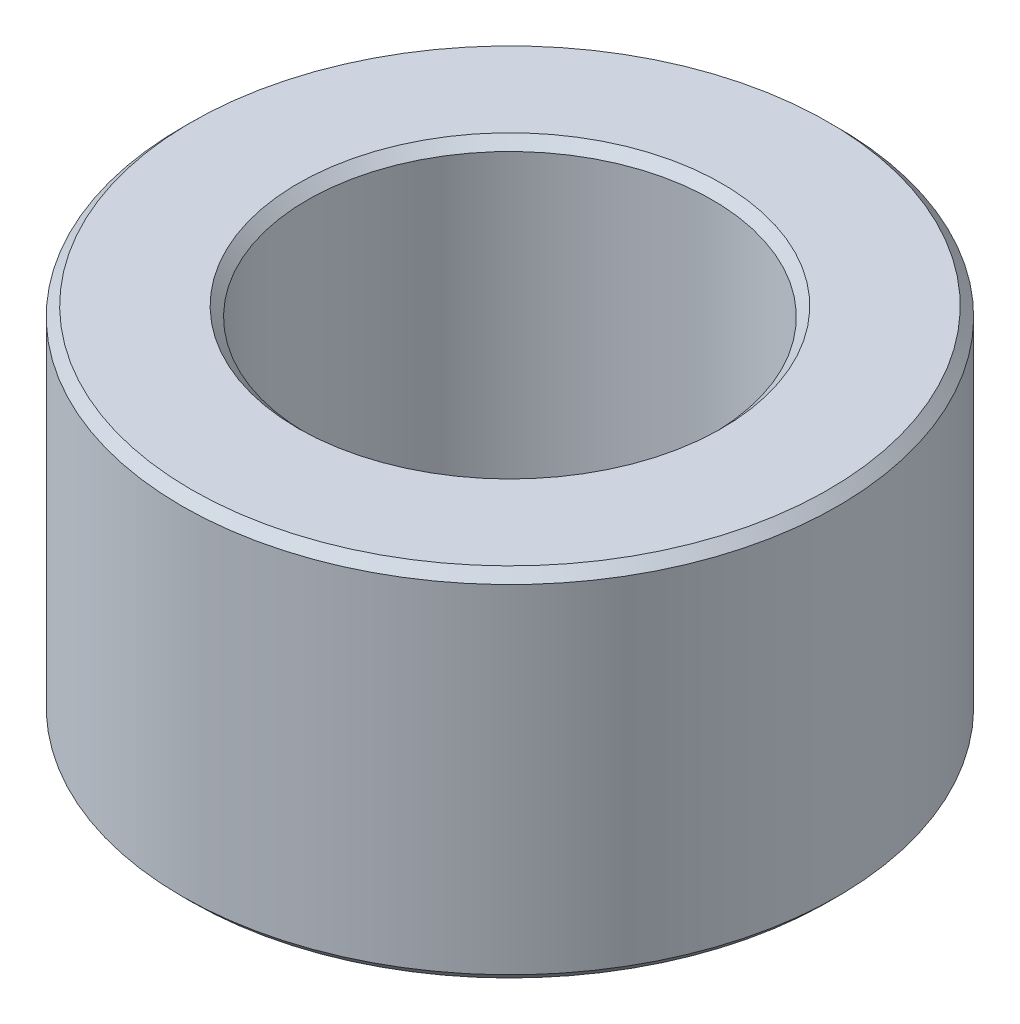
ISO-10303-21;
HEADER;
FILE_DESCRIPTION(('STEP AP214'),'2;1');
FILE_NAME('part.step','',(''),(''),'','','');
FILE_SCHEMA(('AUTOMOTIVE_DESIGN { 1 0 10303 214 1 1 1 1 }'));
ENDSEC;
DATA;
#1=APPLICATION_CONTEXT('core data for automotive mechanical design processes');
#2=APPLICATION_PROTOCOL_DEFINITION('international standard','automotive_design',2000,#1);
#3=PRODUCT_CONTEXT('',#1,'mechanical');
#4=PRODUCT('Part','Part','',(#3));
#5=PRODUCT_RELATED_PRODUCT_CATEGORY('part','',(#4));
#6=PRODUCT_DEFINITION_FORMATION('','',#4);
#7=PRODUCT_DEFINITION_CONTEXT('part definition',#1,'design');
#8=PRODUCT_DEFINITION('design','',#6,#7);
#9=PRODUCT_DEFINITION_SHAPE('','',#8);
#10=(LENGTH_UNIT() NAMED_UNIT(*) SI_UNIT(.MILLI.,.METRE.));
#11=(NAMED_UNIT(*) PLANE_ANGLE_UNIT() SI_UNIT($,.RADIAN.));
#12=(NAMED_UNIT(*) SI_UNIT($,.STERADIAN.) SOLID_ANGLE_UNIT());
#13=UNCERTAINTY_MEASURE_WITH_UNIT(LENGTH_MEASURE(1.E-05),#10,'distance_accuracy_value','');
#14=(GEOMETRIC_REPRESENTATION_CONTEXT(3) GLOBAL_UNCERTAINTY_ASSIGNED_CONTEXT((#13)) GLOBAL_UNIT_ASSIGNED_CONTEXT((#10,
#11,#12)) REPRESENTATION_CONTEXT('',''));
#15=CARTESIAN_POINT('',(0.,0.,0.));
#16=DIRECTION('',(0.,0.,1.));
#17=DIRECTION('',(1.,0.,0.));
#18=AXIS2_PLACEMENT_3D('',#15,#16,#17);
#19=CARTESIAN_POINT('',(0.,4.7,0.));
#20=DIRECTION('',(0.,1.,0.));
#21=DIRECTION('',(0.,0.,1.));
#22=AXIS2_PLACEMENT_3D('',#19,#20,#21);
#23=PLANE('',#22);
#24=CARTESIAN_POINT('',(0.,4.7,0.));
#25=DIRECTION('',(0.,1.,0.));
#26=DIRECTION('',(0.,0.,1.));
#27=AXIS2_PLACEMENT_3D('',#24,#25,#26);
#28=CIRCLE('',#27,5.584);
#29=CARTESIAN_POINT('',(0.,4.7,5.584));
#30=VERTEX_POINT('',#29);
#31=EDGE_CURVE('E11',#30,#30,#28,.F.);
#32=ORIENTED_EDGE('',*,*,#31,.T.);
#33=EDGE_LOOP('',(#32));
#34=FACE_BOUND('',#33,.T.);
#35=CARTESIAN_POINT('',(0.,4.7,0.));
#36=DIRECTION('',(0.,1.,0.));
#37=DIRECTION('',(0.,0.,1.));
#38=AXIS2_PLACEMENT_3D('',#35,#36,#37);
#39=CIRCLE('',#38,8.386);
#40=CARTESIAN_POINT('',(0.,4.7,8.386));
#41=VERTEX_POINT('',#40);
#42=EDGE_CURVE('E45',#41,#41,#39,.T.);
#43=ORIENTED_EDGE('',*,*,#42,.T.);
#44=EDGE_LOOP('',(#43));
#45=FACE_BOUND('',#44,.T.);
#46=ADVANCED_FACE('F38',(#34,#45),#23,.T.);
#47=CARTESIAN_POINT('',(0.,-4.7,0.));
#48=DIRECTION('',(0.,1.,0.));
#49=DIRECTION('',(0.,0.,1.));
#50=AXIS2_PLACEMENT_3D('',#47,#48,#49);
#51=PLANE('',#50);
#52=CARTESIAN_POINT('',(0.,-4.7,0.));
#53=DIRECTION('',(0.,1.,0.));
#54=DIRECTION('',(0.,0.,1.));
#55=AXIS2_PLACEMENT_3D('',#52,#53,#54);
#56=CIRCLE('',#55,5.584);
#57=CARTESIAN_POINT('',(0.,-4.7,5.584));
#58=VERTEX_POINT('',#57);
#59=EDGE_CURVE('E64',#58,#58,#56,.T.);
#60=ORIENTED_EDGE('',*,*,#59,.T.);
#61=EDGE_LOOP('',(#60));
#62=FACE_BOUND('',#61,.T.);
#63=CARTESIAN_POINT('',(0.,-4.7,0.));
#64=DIRECTION('',(0.,1.,0.));
#65=DIRECTION('',(0.,0.,1.));
#66=AXIS2_PLACEMENT_3D('',#63,#64,#65);
#67=CIRCLE('',#66,8.386);
#68=CARTESIAN_POINT('',(0.,-4.7,8.386));
#69=VERTEX_POINT('',#68);
#70=EDGE_CURVE('E67',#69,#69,#67,.F.);
#71=ORIENTED_EDGE('',*,*,#70,.T.);
#72=EDGE_LOOP('',(#71));
#73=FACE_BOUND('',#72,.T.);
#74=ADVANCED_FACE('F71',(#62,#73),#51,.F.);
#75=CARTESIAN_POINT('',(0.,4.7,0.));
#76=DIRECTION('',(0.,-1.,0.));
#77=DIRECTION('',(0.,0.,-1.));
#78=AXIS2_PLACEMENT_3D('',#75,#76,#77);
#79=CYLINDRICAL_SURFACE('',#78,8.636);
#80=CARTESIAN_POINT('',(0.,-4.45,0.));
#81=DIRECTION('',(0.,1.,0.));
#82=DIRECTION('',(0.,0.,1.));
#83=AXIS2_PLACEMENT_3D('',#80,#81,#82);
#84=CIRCLE('',#83,8.636);
#85=CARTESIAN_POINT('',(0.,-4.45,8.636));
#86=VERTEX_POINT('',#85);
#87=EDGE_CURVE('E49',#86,#86,#84,.T.);
#88=ORIENTED_EDGE('',*,*,#87,.T.);
#89=EDGE_LOOP('',(#88));
#90=FACE_BOUND('',#89,.T.);
#91=CARTESIAN_POINT('',(0.,4.45,0.));
#92=DIRECTION('',(0.,1.,0.));
#93=DIRECTION('',(0.,0.,1.));
#94=AXIS2_PLACEMENT_3D('',#91,#92,#93);
#95=CIRCLE('',#94,8.636);
#96=CARTESIAN_POINT('',(0.,4.45,8.636));
#97=VERTEX_POINT('',#96);
#98=EDGE_CURVE('E53',#97,#97,#95,.F.);
#99=ORIENTED_EDGE('',*,*,#98,.T.);
#100=EDGE_LOOP('',(#99));
#101=FACE_BOUND('',#100,.T.);
#102=ADVANCED_FACE('F81',(#90,#101),#79,.T.);
#103=CARTESIAN_POINT('',(0.,4.7,0.));
#104=DIRECTION('',(0.,-1.,0.));
#105=DIRECTION('',(0.,0.,-1.));
#106=AXIS2_PLACEMENT_3D('',#103,#104,#105);
#107=CYLINDRICAL_SURFACE('',#106,5.334);
#108=CARTESIAN_POINT('',(0.,-4.45,0.));
#109=DIRECTION('',(0.,1.,0.));
#110=DIRECTION('',(0.,0.,1.));
#111=AXIS2_PLACEMENT_3D('',#108,#109,#110);
#112=CIRCLE('',#111,5.334);
#113=CARTESIAN_POINT('',(0.,-4.45,5.334));
#114=VERTEX_POINT('',#113);
#115=EDGE_CURVE('E58',#114,#114,#112,.F.);
#116=ORIENTED_EDGE('',*,*,#115,.T.);
#117=EDGE_LOOP('',(#116));
#118=FACE_BOUND('',#117,.T.);
#119=CARTESIAN_POINT('',(0.,4.45,0.));
#120=DIRECTION('',(0.,1.,0.));
#121=DIRECTION('',(0.,0.,1.));
#122=AXIS2_PLACEMENT_3D('',#119,#120,#121);
#123=CIRCLE('',#122,5.334);
#124=CARTESIAN_POINT('',(0.,4.45,5.334));
#125=VERTEX_POINT('',#124);
#126=EDGE_CURVE('E61',#125,#125,#123,.T.);
#127=ORIENTED_EDGE('',*,*,#126,.T.);
#128=EDGE_LOOP('',(#127));
#129=FACE_BOUND('',#128,.T.);
#130=ADVANCED_FACE('F84',(#118,#129),#107,.F.);
#131=CARTESIAN_POINT('',(0.,-4.7,0.));
#132=DIRECTION('',(0.,-1.,0.));
#133=DIRECTION('',(0.,0.,-1.));
#134=AXIS2_PLACEMENT_3D('',#131,#132,#133);
#135=CONICAL_SURFACE('',#134,5.584,0.785398163397447);
#136=ORIENTED_EDGE('',*,*,#115,.F.);
#137=EDGE_LOOP('',(#136));
#138=FACE_BOUND('',#137,.T.);
#139=ORIENTED_EDGE('',*,*,#59,.F.);
#140=EDGE_LOOP('',(#139));
#141=FACE_BOUND('',#140,.T.);
#142=ADVANCED_FACE('F77',(#138,#141),#135,.F.);
#143=CARTESIAN_POINT('',(0.,-4.45,0.));
#144=DIRECTION('',(0.,1.,0.));
#145=DIRECTION('',(0.,0.,1.));
#146=AXIS2_PLACEMENT_3D('',#143,#144,#145);
#147=CONICAL_SURFACE('',#146,8.636,0.785398163397448);
#148=ORIENTED_EDGE('',*,*,#70,.F.);
#149=EDGE_LOOP('',(#148));
#150=FACE_BOUND('',#149,.T.);
#151=ORIENTED_EDGE('',*,*,#87,.F.);
#152=EDGE_LOOP('',(#151));
#153=FACE_BOUND('',#152,.T.);
#154=ADVANCED_FACE('F73',(#150,#153),#147,.T.);
#155=CARTESIAN_POINT('',(0.,4.45,0.));
#156=DIRECTION('',(0.,1.,0.));
#157=DIRECTION('',(0.,0.,1.));
#158=AXIS2_PLACEMENT_3D('',#155,#156,#157);
#159=CONICAL_SURFACE('',#158,5.334,0.785398163397448);
#160=ORIENTED_EDGE('',*,*,#31,.F.);
#161=EDGE_LOOP('',(#160));
#162=FACE_BOUND('',#161,.T.);
#163=ORIENTED_EDGE('',*,*,#126,.F.);
#164=EDGE_LOOP('',(#163));
#165=FACE_BOUND('',#164,.T.);
#166=ADVANCED_FACE('F76',(#162,#165),#159,.F.);
#167=CARTESIAN_POINT('',(0.,4.7,0.));
#168=DIRECTION('',(0.,-1.,0.));
#169=DIRECTION('',(0.,0.,-1.));
#170=AXIS2_PLACEMENT_3D('',#167,#168,#169);
#171=CONICAL_SURFACE('',#170,8.386,0.785398163397445);
#172=ORIENTED_EDGE('',*,*,#98,.F.);
#173=EDGE_LOOP('',(#172));
#174=FACE_BOUND('',#173,.T.);
#175=ORIENTED_EDGE('',*,*,#42,.F.);
#176=EDGE_LOOP('',(#175));
#177=FACE_BOUND('',#176,.T.);
#178=ADVANCED_FACE('F40',(#174,#177),#171,.T.);
#179=CLOSED_SHELL('',(#46,#74,#102,#130,#142,#154,#166,#178));
#180=MANIFOLD_SOLID_BREP('B2',#179);
#181=ADVANCED_BREP_SHAPE_REPRESENTATION('',(#18,#180),#14);
#182=SHAPE_DEFINITION_REPRESENTATION(#9,#181);
ENDSEC;
END-ISO-10303-21;
